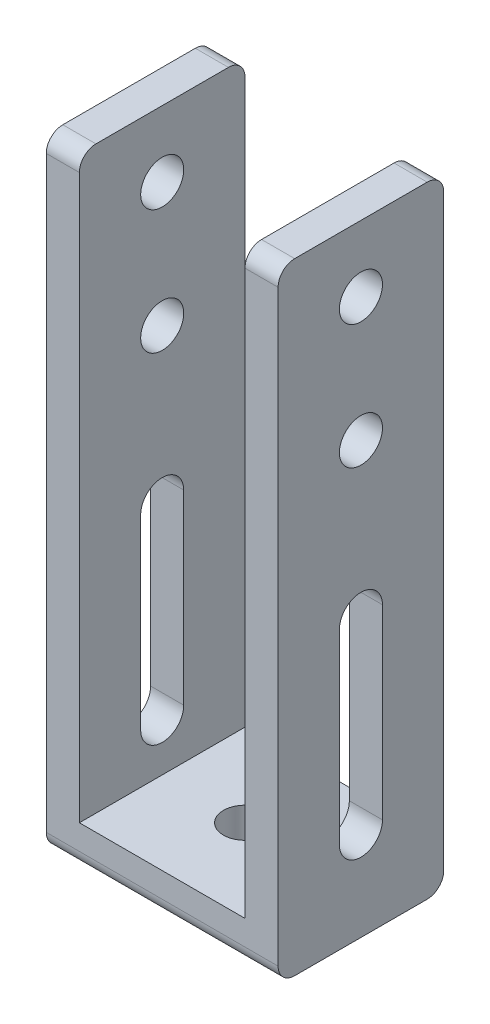
ISO-10303-21;
HEADER;
FILE_DESCRIPTION(('STEP AP214'),'2;1');
FILE_NAME('part.step','',(''),(''),'','','');
FILE_SCHEMA(('AUTOMOTIVE_DESIGN { 1 0 10303 214 1 1 1 1 }'));
ENDSEC;
DATA;
#1=APPLICATION_CONTEXT('core data for automotive mechanical design processes');
#2=APPLICATION_PROTOCOL_DEFINITION('international standard','automotive_design',2000,#1);
#3=PRODUCT_CONTEXT('',#1,'mechanical');
#4=PRODUCT('Part','Part','',(#3));
#5=PRODUCT_RELATED_PRODUCT_CATEGORY('part','',(#4));
#6=PRODUCT_DEFINITION_FORMATION('','',#4);
#7=PRODUCT_DEFINITION_CONTEXT('part definition',#1,'design');
#8=PRODUCT_DEFINITION('design','',#6,#7);
#9=PRODUCT_DEFINITION_SHAPE('','',#8);
#10=(LENGTH_UNIT() NAMED_UNIT(*) SI_UNIT(.MILLI.,.METRE.));
#11=(NAMED_UNIT(*) PLANE_ANGLE_UNIT() SI_UNIT($,.RADIAN.));
#12=(NAMED_UNIT(*) SI_UNIT($,.STERADIAN.) SOLID_ANGLE_UNIT());
#13=UNCERTAINTY_MEASURE_WITH_UNIT(LENGTH_MEASURE(1.E-05),#10,'distance_accuracy_value','');
#14=(GEOMETRIC_REPRESENTATION_CONTEXT(3) GLOBAL_UNCERTAINTY_ASSIGNED_CONTEXT((#13)) GLOBAL_UNIT_ASSIGNED_CONTEXT((#10,
#11,#12)) REPRESENTATION_CONTEXT('',''));
#15=CARTESIAN_POINT('',(0.,0.,0.));
#16=DIRECTION('',(0.,0.,1.));
#17=DIRECTION('',(1.,0.,0.));
#18=AXIS2_PLACEMENT_3D('',#15,#16,#17);
#19=CARTESIAN_POINT('',(0.,5.,0.));
#20=DIRECTION('',(0.,1.,0.));
#21=DIRECTION('',(0.,0.,1.));
#22=AXIS2_PLACEMENT_3D('',#19,#20,#21);
#23=PLANE('',#22);
#24=CARTESIAN_POINT('',(0.,5.,0.));
#25=DIRECTION('',(0.,-1.,0.));
#26=DIRECTION('',(0.,0.,-1.));
#27=AXIS2_PLACEMENT_3D('',#24,#25,#26);
#28=CIRCLE('',#27,2.6);
#29=CARTESIAN_POINT('',(0.,5.,-2.6));
#30=VERTEX_POINT('',#29);
#31=EDGE_CURVE('E285',#30,#30,#28,.T.);
#32=ORIENTED_EDGE('',*,*,#31,.T.);
#33=EDGE_LOOP('',(#32));
#34=FACE_BOUND('',#33,.T.);
#35=DIRECTION('',(1.,0.,0.));
#36=VECTOR('',#35,1.);
#37=CARTESIAN_POINT('',(-14.,5.,10.));
#38=LINE('',#37,#36);
#39=CARTESIAN_POINT('',(-10.,5.,10.));
#40=VERTEX_POINT('',#39);
#41=CARTESIAN_POINT('',(10.,5.,10.));
#42=VERTEX_POINT('',#41);
#43=EDGE_CURVE('E332',#40,#42,#38,.T.);
#44=ORIENTED_EDGE('',*,*,#43,.T.);
#45=DIRECTION('',(0.,0.,1.));
#46=VECTOR('',#45,1.);
#47=CARTESIAN_POINT('',(10.,5.,-10.));
#48=LINE('',#47,#46);
#49=CARTESIAN_POINT('',(10.,5.,-10.));
#50=VERTEX_POINT('',#49);
#51=EDGE_CURVE('E299',#50,#42,#48,.T.);
#52=ORIENTED_EDGE('',*,*,#51,.F.);
#53=DIRECTION('',(-1.,0.,0.));
#54=VECTOR('',#53,1.);
#55=CARTESIAN_POINT('',(-14.,5.,-10.));
#56=LINE('',#55,#54);
#57=CARTESIAN_POINT('',(-10.,5.,-10.));
#58=VERTEX_POINT('',#57);
#59=EDGE_CURVE('E328',#50,#58,#56,.T.);
#60=ORIENTED_EDGE('',*,*,#59,.T.);
#61=DIRECTION('',(0.,0.,-1.));
#62=VECTOR('',#61,1.);
#63=CARTESIAN_POINT('',(-10.,5.,-10.));
#64=LINE('',#63,#62);
#65=EDGE_CURVE('E303',#40,#58,#64,.T.);
#66=ORIENTED_EDGE('',*,*,#65,.F.);
#67=EDGE_LOOP('',(#44,#52,#60,#66));
#68=FACE_BOUND('',#67,.T.);
#69=ADVANCED_FACE('F43',(#34,#68),#23,.T.);
#70=CARTESIAN_POINT('',(14.,5.,-10.));
#71=DIRECTION('',(-1.,0.,0.));
#72=DIRECTION('',(0.,0.,1.));
#73=AXIS2_PLACEMENT_3D('',#70,#71,#72);
#74=PLANE('',#73);
#75=CARTESIAN_POINT('',(14.,67.,0.));
#76=DIRECTION('',(1.,0.,0.));
#77=DIRECTION('',(0.,0.,-1.));
#78=AXIS2_PLACEMENT_3D('',#75,#76,#77);
#79=CIRCLE('',#78,2.60000000000001);
#80=CARTESIAN_POINT('',(14.,67.,-2.60000000000001));
#81=VERTEX_POINT('',#80);
#82=EDGE_CURVE('E229',#81,#81,#79,.T.);
#83=ORIENTED_EDGE('',*,*,#82,.F.);
#84=EDGE_LOOP('',(#83));
#85=FACE_BOUND('',#84,.T.);
#86=CARTESIAN_POINT('',(14.,52.,0.));
#87=DIRECTION('',(1.,0.,0.));
#88=DIRECTION('',(0.,0.,-1.));
#89=AXIS2_PLACEMENT_3D('',#86,#87,#88);
#90=CIRCLE('',#89,2.6);
#91=CARTESIAN_POINT('',(14.,52.,-2.6));
#92=VERTEX_POINT('',#91);
#93=EDGE_CURVE('E224',#92,#92,#90,.T.);
#94=ORIENTED_EDGE('',*,*,#93,.F.);
#95=EDGE_LOOP('',(#94));
#96=FACE_BOUND('',#95,.T.);
#97=DIRECTION('',(0.,-1.,0.));
#98=VECTOR('',#97,1.);
#99=CARTESIAN_POINT('',(14.,33.5,2.6));
#100=LINE('',#99,#98);
#101=CARTESIAN_POINT('',(14.,33.5,2.6));
#102=VERTEX_POINT('',#101);
#103=CARTESIAN_POINT('',(14.,11.,2.6));
#104=VERTEX_POINT('',#103);
#105=EDGE_CURVE('E222',#102,#104,#100,.T.);
#106=ORIENTED_EDGE('',*,*,#105,.F.);
#107=CARTESIAN_POINT('',(14.,33.5,0.));
#108=DIRECTION('',(1.,0.,0.));
#109=DIRECTION('',(0.,0.,-1.));
#110=AXIS2_PLACEMENT_3D('',#107,#108,#109);
#111=CIRCLE('',#110,2.6);
#112=CARTESIAN_POINT('',(14.,33.5,-2.6));
#113=VERTEX_POINT('',#112);
#114=EDGE_CURVE('E197',#113,#102,#111,.T.);
#115=ORIENTED_EDGE('',*,*,#114,.F.);
#116=DIRECTION('',(0.,1.,0.));
#117=VECTOR('',#116,1.);
#118=CARTESIAN_POINT('',(14.,33.5,-2.6));
#119=LINE('',#118,#117);
#120=CARTESIAN_POINT('',(14.,11.,-2.6));
#121=VERTEX_POINT('',#120);
#122=EDGE_CURVE('E207',#121,#113,#119,.T.);
#123=ORIENTED_EDGE('',*,*,#122,.F.);
#124=CARTESIAN_POINT('',(14.,11.,0.));
#125=DIRECTION('',(1.,0.,0.));
#126=DIRECTION('',(0.,0.,-1.));
#127=AXIS2_PLACEMENT_3D('',#124,#125,#126);
#128=CIRCLE('',#127,2.6);
#129=EDGE_CURVE('E215',#104,#121,#128,.T.);
#130=ORIENTED_EDGE('',*,*,#129,.F.);
#131=EDGE_LOOP('',(#106,#115,#123,#130));
#132=FACE_BOUND('',#131,.T.);
#133=DIRECTION('',(0.,-1.,0.));
#134=VECTOR('',#133,1.);
#135=CARTESIAN_POINT('',(14.,5.,10.));
#136=LINE('',#135,#134);
#137=CARTESIAN_POINT('',(14.,73.,10.));
#138=VERTEX_POINT('',#137);
#139=CARTESIAN_POINT('',(14.,2.,10.));
#140=VERTEX_POINT('',#139);
#141=EDGE_CURVE('E337',#138,#140,#136,.T.);
#142=ORIENTED_EDGE('',*,*,#141,.T.);
#143=CARTESIAN_POINT('',(14.,2.,8.));
#144=DIRECTION('',(-1.,0.,0.));
#145=DIRECTION('',(0.,0.,1.));
#146=AXIS2_PLACEMENT_3D('',#143,#144,#145);
#147=CIRCLE('',#146,2.);
#148=CARTESIAN_POINT('',(14.,0.,8.));
#149=VERTEX_POINT('',#148);
#150=EDGE_CURVE('E397',#140,#149,#147,.F.);
#151=ORIENTED_EDGE('',*,*,#150,.T.);
#152=DIRECTION('',(0.,0.,-1.));
#153=VECTOR('',#152,1.);
#154=CARTESIAN_POINT('',(14.,0.,-10.));
#155=LINE('',#154,#153);
#156=CARTESIAN_POINT('',(14.,0.,-8.));
#157=VERTEX_POINT('',#156);
#158=EDGE_CURVE('E327',#149,#157,#155,.T.);
#159=ORIENTED_EDGE('',*,*,#158,.T.);
#160=CARTESIAN_POINT('',(14.,2.,-8.));
#161=DIRECTION('',(-1.,0.,0.));
#162=DIRECTION('',(0.,0.,1.));
#163=AXIS2_PLACEMENT_3D('',#160,#161,#162);
#164=CIRCLE('',#163,2.);
#165=CARTESIAN_POINT('',(14.,2.,-10.));
#166=VERTEX_POINT('',#165);
#167=EDGE_CURVE('E394',#157,#166,#164,.F.);
#168=ORIENTED_EDGE('',*,*,#167,.T.);
#169=DIRECTION('',(0.,-1.,0.));
#170=VECTOR('',#169,1.);
#171=CARTESIAN_POINT('',(14.,5.,-10.));
#172=LINE('',#171,#170);
#173=CARTESIAN_POINT('',(14.,73.,-10.));
#174=VERTEX_POINT('',#173);
#175=EDGE_CURVE('E355',#174,#166,#172,.T.);
#176=ORIENTED_EDGE('',*,*,#175,.F.);
#177=CARTESIAN_POINT('',(14.,73.,-8.));
#178=DIRECTION('',(-1.,0.,0.));
#179=DIRECTION('',(0.,0.,1.));
#180=AXIS2_PLACEMENT_3D('',#177,#178,#179);
#181=CIRCLE('',#180,2.);
#182=CARTESIAN_POINT('',(14.,75.,-8.));
#183=VERTEX_POINT('',#182);
#184=EDGE_CURVE('E391',#174,#183,#181,.F.);
#185=ORIENTED_EDGE('',*,*,#184,.T.);
#186=DIRECTION('',(0.,0.,-1.));
#187=VECTOR('',#186,1.);
#188=CARTESIAN_POINT('',(14.,75.,-10.));
#189=LINE('',#188,#187);
#190=CARTESIAN_POINT('',(14.,75.,8.));
#191=VERTEX_POINT('',#190);
#192=EDGE_CURVE('E304',#191,#183,#189,.T.);
#193=ORIENTED_EDGE('',*,*,#192,.F.);
#194=CARTESIAN_POINT('',(14.,73.,8.));
#195=DIRECTION('',(-1.,0.,0.));
#196=DIRECTION('',(0.,0.,1.));
#197=AXIS2_PLACEMENT_3D('',#194,#195,#196);
#198=CIRCLE('',#197,2.);
#199=EDGE_CURVE('E388',#191,#138,#198,.F.);
#200=ORIENTED_EDGE('',*,*,#199,.T.);
#201=EDGE_LOOP('',(#142,#151,#159,#168,#176,#185,#193,#200));
#202=FACE_BOUND('',#201,.T.);
#203=ADVANCED_FACE('F219',(#85,#96,#132,#202),#74,.F.);
#204=CARTESIAN_POINT('',(-14.,5.,-10.));
#205=DIRECTION('',(0.,0.,1.));
#206=DIRECTION('',(1.,0.,0.));
#207=AXIS2_PLACEMENT_3D('',#204,#205,#206);
#208=PLANE('',#207);
#209=ORIENTED_EDGE('',*,*,#175,.T.);
#210=DIRECTION('',(-1.,0.,0.));
#211=VECTOR('',#210,1.);
#212=CARTESIAN_POINT('',(-14.,2.,-10.));
#213=LINE('',#212,#211);
#214=CARTESIAN_POINT('',(-14.,2.,-10.));
#215=VERTEX_POINT('',#214);
#216=EDGE_CURVE('E424',#166,#215,#213,.T.);
#217=ORIENTED_EDGE('',*,*,#216,.T.);
#218=DIRECTION('',(0.,-1.,0.));
#219=VECTOR('',#218,1.);
#220=CARTESIAN_POINT('',(-14.,5.,-10.));
#221=LINE('',#220,#219);
#222=CARTESIAN_POINT('',(-14.,73.,-10.));
#223=VERTEX_POINT('',#222);
#224=EDGE_CURVE('E351',#223,#215,#221,.T.);
#225=ORIENTED_EDGE('',*,*,#224,.F.);
#226=DIRECTION('',(-1.,0.,0.));
#227=VECTOR('',#226,1.);
#228=CARTESIAN_POINT('',(-10.,73.,-10.));
#229=LINE('',#228,#227);
#230=CARTESIAN_POINT('',(-10.,73.,-10.));
#231=VERTEX_POINT('',#230);
#232=EDGE_CURVE('E418',#223,#231,#229,.F.);
#233=ORIENTED_EDGE('',*,*,#232,.T.);
#234=DIRECTION('',(0.,-1.,0.));
#235=VECTOR('',#234,1.);
#236=CARTESIAN_POINT('',(-10.,75.,-10.));
#237=LINE('',#236,#235);
#238=EDGE_CURVE('E318',#231,#58,#237,.T.);
#239=ORIENTED_EDGE('',*,*,#238,.T.);
#240=ORIENTED_EDGE('',*,*,#59,.F.);
#241=DIRECTION('',(0.,-1.,0.));
#242=VECTOR('',#241,1.);
#243=CARTESIAN_POINT('',(10.,75.,-10.));
#244=LINE('',#243,#242);
#245=CARTESIAN_POINT('',(10.,73.,-10.));
#246=VERTEX_POINT('',#245);
#247=EDGE_CURVE('E289',#246,#50,#244,.T.);
#248=ORIENTED_EDGE('',*,*,#247,.F.);
#249=DIRECTION('',(-1.,0.,0.));
#250=VECTOR('',#249,1.);
#251=CARTESIAN_POINT('',(-14.,73.,-10.));
#252=LINE('',#251,#250);
#253=EDGE_CURVE('E421',#246,#174,#252,.F.);
#254=ORIENTED_EDGE('',*,*,#253,.T.);
#255=EDGE_LOOP('',(#209,#217,#225,#233,#239,#240,#248,#254));
#256=FACE_BOUND('',#255,.T.);
#257=ADVANCED_FACE('F469',(#256),#208,.F.);
#258=CARTESIAN_POINT('',(-14.,5.,-10.));
#259=DIRECTION('',(1.,0.,0.));
#260=DIRECTION('',(0.,0.,-1.));
#261=AXIS2_PLACEMENT_3D('',#258,#259,#260);
#262=PLANE('',#261);
#263=CARTESIAN_POINT('',(-14.,67.,0.));
#264=DIRECTION('',(1.,0.,0.));
#265=DIRECTION('',(0.,0.,-1.));
#266=AXIS2_PLACEMENT_3D('',#263,#264,#265);
#267=CIRCLE('',#266,2.60000000000001);
#268=CARTESIAN_POINT('',(-14.,67.,-2.6));
#269=VERTEX_POINT('',#268);
#270=EDGE_CURVE('E280',#269,#269,#267,.T.);
#271=ORIENTED_EDGE('',*,*,#270,.T.);
#272=EDGE_LOOP('',(#271));
#273=FACE_BOUND('',#272,.T.);
#274=CARTESIAN_POINT('',(-14.,52.,0.));
#275=DIRECTION('',(1.,0.,0.));
#276=DIRECTION('',(0.,0.,-1.));
#277=AXIS2_PLACEMENT_3D('',#274,#275,#276);
#278=CIRCLE('',#277,2.6);
#279=CARTESIAN_POINT('',(-14.,52.,-2.6));
#280=VERTEX_POINT('',#279);
#281=EDGE_CURVE('E271',#280,#280,#278,.T.);
#282=ORIENTED_EDGE('',*,*,#281,.T.);
#283=EDGE_LOOP('',(#282));
#284=FACE_BOUND('',#283,.T.);
#285=DIRECTION('',(0.,1.,0.));
#286=VECTOR('',#285,1.);
#287=CARTESIAN_POINT('',(-14.,5.,-2.6));
#288=LINE('',#287,#286);
#289=CARTESIAN_POINT('',(-14.,11.,-2.6));
#290=VERTEX_POINT('',#289);
#291=CARTESIAN_POINT('',(-14.,33.5,-2.6));
#292=VERTEX_POINT('',#291);
#293=EDGE_CURVE('E254',#290,#292,#288,.T.);
#294=ORIENTED_EDGE('',*,*,#293,.T.);
#295=CARTESIAN_POINT('',(-14.,33.5,0.));
#296=DIRECTION('',(1.,0.,0.));
#297=DIRECTION('',(0.,0.,-1.));
#298=AXIS2_PLACEMENT_3D('',#295,#296,#297);
#299=CIRCLE('',#298,2.6);
#300=CARTESIAN_POINT('',(-14.,33.5,2.6));
#301=VERTEX_POINT('',#300);
#302=EDGE_CURVE('E262',#292,#301,#299,.T.);
#303=ORIENTED_EDGE('',*,*,#302,.T.);
#304=DIRECTION('',(0.,-1.,0.));
#305=VECTOR('',#304,1.);
#306=CARTESIAN_POINT('',(-14.,5.,2.6));
#307=LINE('',#306,#305);
#308=CARTESIAN_POINT('',(-14.,11.,2.6));
#309=VERTEX_POINT('',#308);
#310=EDGE_CURVE('E238',#301,#309,#307,.T.);
#311=ORIENTED_EDGE('',*,*,#310,.T.);
#312=CARTESIAN_POINT('',(-14.,11.,0.));
#313=DIRECTION('',(1.,0.,0.));
#314=DIRECTION('',(0.,0.,-1.));
#315=AXIS2_PLACEMENT_3D('',#312,#313,#314);
#316=CIRCLE('',#315,2.6);
#317=EDGE_CURVE('E246',#309,#290,#316,.T.);
#318=ORIENTED_EDGE('',*,*,#317,.T.);
#319=EDGE_LOOP('',(#294,#303,#311,#318));
#320=FACE_BOUND('',#319,.T.);
#321=DIRECTION('',(0.,0.,1.));
#322=VECTOR('',#321,1.);
#323=CARTESIAN_POINT('',(-14.,0.,-10.));
#324=LINE('',#323,#322);
#325=CARTESIAN_POINT('',(-14.,0.,-8.));
#326=VERTEX_POINT('',#325);
#327=CARTESIAN_POINT('',(-14.,0.,8.));
#328=VERTEX_POINT('',#327);
#329=EDGE_CURVE('E333',#326,#328,#324,.T.);
#330=ORIENTED_EDGE('',*,*,#329,.T.);
#331=CARTESIAN_POINT('',(-14.,2.,8.));
#332=DIRECTION('',(1.,0.,0.));
#333=DIRECTION('',(0.,0.,-1.));
#334=AXIS2_PLACEMENT_3D('',#331,#332,#333);
#335=CIRCLE('',#334,2.);
#336=CARTESIAN_POINT('',(-14.,2.,10.));
#337=VERTEX_POINT('',#336);
#338=EDGE_CURVE('E415',#328,#337,#335,.F.);
#339=ORIENTED_EDGE('',*,*,#338,.T.);
#340=DIRECTION('',(0.,-1.,0.));
#341=VECTOR('',#340,1.);
#342=CARTESIAN_POINT('',(-14.,5.,10.));
#343=LINE('',#342,#341);
#344=CARTESIAN_POINT('',(-14.,73.,10.));
#345=VERTEX_POINT('',#344);
#346=EDGE_CURVE('E347',#345,#337,#343,.T.);
#347=ORIENTED_EDGE('',*,*,#346,.F.);
#348=CARTESIAN_POINT('',(-14.,73.,8.));
#349=DIRECTION('',(1.,0.,0.));
#350=DIRECTION('',(0.,0.,-1.));
#351=AXIS2_PLACEMENT_3D('',#348,#349,#350);
#352=CIRCLE('',#351,2.);
#353=CARTESIAN_POINT('',(-14.,75.,8.));
#354=VERTEX_POINT('',#353);
#355=EDGE_CURVE('E406',#345,#354,#352,.F.);
#356=ORIENTED_EDGE('',*,*,#355,.T.);
#357=DIRECTION('',(0.,0.,1.));
#358=VECTOR('',#357,1.);
#359=CARTESIAN_POINT('',(-14.,75.,-10.));
#360=LINE('',#359,#358);
#361=CARTESIAN_POINT('',(-14.,75.,-8.));
#362=VERTEX_POINT('',#361);
#363=EDGE_CURVE('E311',#362,#354,#360,.T.);
#364=ORIENTED_EDGE('',*,*,#363,.F.);
#365=CARTESIAN_POINT('',(-14.,73.,-8.));
#366=DIRECTION('',(1.,0.,0.));
#367=DIRECTION('',(0.,0.,-1.));
#368=AXIS2_PLACEMENT_3D('',#365,#366,#367);
#369=CIRCLE('',#368,2.);
#370=EDGE_CURVE('E409',#362,#223,#369,.F.);
#371=ORIENTED_EDGE('',*,*,#370,.T.);
#372=ORIENTED_EDGE('',*,*,#224,.T.);
#373=CARTESIAN_POINT('',(-14.,2.,-8.));
#374=DIRECTION('',(1.,0.,0.));
#375=DIRECTION('',(0.,0.,-1.));
#376=AXIS2_PLACEMENT_3D('',#373,#374,#375);
#377=CIRCLE('',#376,2.);
#378=EDGE_CURVE('E412',#215,#326,#377,.F.);
#379=ORIENTED_EDGE('',*,*,#378,.T.);
#380=EDGE_LOOP('',(#330,#339,#347,#356,#364,#371,#372,#379));
#381=FACE_BOUND('',#380,.T.);
#382=ADVANCED_FACE('F460',(#273,#284,#320,#381),#262,.F.);
#383=CARTESIAN_POINT('',(-14.,5.,10.));
#384=DIRECTION('',(0.,0.,-1.));
#385=DIRECTION('',(-1.,0.,0.));
#386=AXIS2_PLACEMENT_3D('',#383,#384,#385);
#387=PLANE('',#386);
#388=ORIENTED_EDGE('',*,*,#346,.T.);
#389=DIRECTION('',(1.,0.,0.));
#390=VECTOR('',#389,1.);
#391=CARTESIAN_POINT('',(-14.,2.,10.));
#392=LINE('',#391,#390);
#393=EDGE_CURVE('E384',#337,#140,#392,.T.);
#394=ORIENTED_EDGE('',*,*,#393,.T.);
#395=ORIENTED_EDGE('',*,*,#141,.F.);
#396=DIRECTION('',(1.,0.,0.));
#397=VECTOR('',#396,1.);
#398=CARTESIAN_POINT('',(-14.,73.,10.));
#399=LINE('',#398,#397);
#400=CARTESIAN_POINT('',(10.,73.,10.));
#401=VERTEX_POINT('',#400);
#402=EDGE_CURVE('E372',#138,#401,#399,.F.);
#403=ORIENTED_EDGE('',*,*,#402,.T.);
#404=DIRECTION('',(0.,-1.,0.));
#405=VECTOR('',#404,1.);
#406=CARTESIAN_POINT('',(10.,75.,10.));
#407=LINE('',#406,#405);
#408=EDGE_CURVE('E295',#401,#42,#407,.T.);
#409=ORIENTED_EDGE('',*,*,#408,.T.);
#410=ORIENTED_EDGE('',*,*,#43,.F.);
#411=DIRECTION('',(0.,-1.,0.));
#412=VECTOR('',#411,1.);
#413=CARTESIAN_POINT('',(-10.,75.,10.));
#414=LINE('',#413,#412);
#415=CARTESIAN_POINT('',(-10.,73.,10.));
#416=VERTEX_POINT('',#415);
#417=EDGE_CURVE('E324',#416,#40,#414,.T.);
#418=ORIENTED_EDGE('',*,*,#417,.F.);
#419=DIRECTION('',(1.,0.,0.));
#420=VECTOR('',#419,1.);
#421=CARTESIAN_POINT('',(-14.,73.,10.));
#422=LINE('',#421,#420);
#423=EDGE_CURVE('E381',#416,#345,#422,.F.);
#424=ORIENTED_EDGE('',*,*,#423,.T.);
#425=EDGE_LOOP('',(#388,#394,#395,#403,#409,#410,#418,#424));
#426=FACE_BOUND('',#425,.T.);
#427=ADVANCED_FACE('F454',(#426),#387,.F.);
#428=CARTESIAN_POINT('',(0.,0.,0.));
#429=DIRECTION('',(0.,1.,0.));
#430=DIRECTION('',(0.,0.,1.));
#431=AXIS2_PLACEMENT_3D('',#428,#429,#430);
#432=PLANE('',#431);
#433=CARTESIAN_POINT('',(0.,0.,0.));
#434=DIRECTION('',(0.,-1.,0.));
#435=DIRECTION('',(0.,0.,-1.));
#436=AXIS2_PLACEMENT_3D('',#433,#434,#435);
#437=CIRCLE('',#436,2.6);
#438=CARTESIAN_POINT('',(0.,0.,-2.6));
#439=VERTEX_POINT('',#438);
#440=EDGE_CURVE('E284',#439,#439,#437,.T.);
#441=ORIENTED_EDGE('',*,*,#440,.F.);
#442=EDGE_LOOP('',(#441));
#443=FACE_BOUND('',#442,.T.);
#444=ORIENTED_EDGE('',*,*,#158,.F.);
#445=DIRECTION('',(1.,0.,0.));
#446=VECTOR('',#445,1.);
#447=CARTESIAN_POINT('',(0.,0.,8.));
#448=LINE('',#447,#446);
#449=EDGE_CURVE('E403',#149,#328,#448,.F.);
#450=ORIENTED_EDGE('',*,*,#449,.T.);
#451=ORIENTED_EDGE('',*,*,#329,.F.);
#452=DIRECTION('',(-1.,0.,0.));
#453=VECTOR('',#452,1.);
#454=CARTESIAN_POINT('',(0.,0.,-8.));
#455=LINE('',#454,#453);
#456=EDGE_CURVE('E400',#326,#157,#455,.F.);
#457=ORIENTED_EDGE('',*,*,#456,.T.);
#458=EDGE_LOOP('',(#444,#450,#451,#457));
#459=FACE_BOUND('',#458,.T.);
#460=ADVANCED_FACE('F480',(#443,#459),#432,.F.);
#461=CARTESIAN_POINT('',(-10.,75.,-10.));
#462=DIRECTION('',(-1.,0.,0.));
#463=DIRECTION('',(0.,0.,1.));
#464=AXIS2_PLACEMENT_3D('',#461,#462,#463);
#465=PLANE('',#464);
#466=CARTESIAN_POINT('',(-9.99999999999999,67.,0.));
#467=DIRECTION('',(-1.,0.,0.));
#468=DIRECTION('',(0.,0.,1.));
#469=AXIS2_PLACEMENT_3D('',#466,#467,#468);
#470=CIRCLE('',#469,2.60000000000001);
#471=CARTESIAN_POINT('',(-9.99999999999999,67.,2.60000000000001));
#472=VERTEX_POINT('',#471);
#473=EDGE_CURVE('E276',#472,#472,#470,.T.);
#474=ORIENTED_EDGE('',*,*,#473,.T.);
#475=EDGE_LOOP('',(#474));
#476=FACE_BOUND('',#475,.T.);
#477=CARTESIAN_POINT('',(-9.99999999999999,52.,0.));
#478=DIRECTION('',(-1.,0.,0.));
#479=DIRECTION('',(0.,0.,1.));
#480=AXIS2_PLACEMENT_3D('',#477,#478,#479);
#481=CIRCLE('',#480,2.6);
#482=CARTESIAN_POINT('',(-9.99999999999999,52.,2.6));
#483=VERTEX_POINT('',#482);
#484=EDGE_CURVE('E267',#483,#483,#481,.T.);
#485=ORIENTED_EDGE('',*,*,#484,.T.);
#486=EDGE_LOOP('',(#485));
#487=FACE_BOUND('',#486,.T.);
#488=DIRECTION('',(0.,1.,0.));
#489=VECTOR('',#488,1.);
#490=CARTESIAN_POINT('',(-10.,75.,2.6));
#491=LINE('',#490,#489);
#492=CARTESIAN_POINT('',(-9.99999999999999,11.,2.6));
#493=VERTEX_POINT('',#492);
#494=CARTESIAN_POINT('',(-10.,33.5,2.6));
#495=VERTEX_POINT('',#494);
#496=EDGE_CURVE('E234',#493,#495,#491,.T.);
#497=ORIENTED_EDGE('',*,*,#496,.T.);
#498=CARTESIAN_POINT('',(-9.99999999999999,33.5,0.));
#499=DIRECTION('',(-1.,0.,0.));
#500=DIRECTION('',(0.,0.,1.));
#501=AXIS2_PLACEMENT_3D('',#498,#499,#500);
#502=CIRCLE('',#501,2.6);
#503=CARTESIAN_POINT('',(-9.99999999999999,33.5,-2.6));
#504=VERTEX_POINT('',#503);
#505=EDGE_CURVE('E258',#495,#504,#502,.T.);
#506=ORIENTED_EDGE('',*,*,#505,.T.);
#507=DIRECTION('',(0.,-1.,0.));
#508=VECTOR('',#507,1.);
#509=CARTESIAN_POINT('',(-10.,75.,-2.6));
#510=LINE('',#509,#508);
#511=CARTESIAN_POINT('',(-9.99999999999999,11.,-2.6));
#512=VERTEX_POINT('',#511);
#513=EDGE_CURVE('E250',#504,#512,#510,.T.);
#514=ORIENTED_EDGE('',*,*,#513,.T.);
#515=CARTESIAN_POINT('',(-9.99999999999999,11.,0.));
#516=DIRECTION('',(-1.,0.,0.));
#517=DIRECTION('',(0.,0.,1.));
#518=AXIS2_PLACEMENT_3D('',#515,#516,#517);
#519=CIRCLE('',#518,2.6);
#520=EDGE_CURVE('E242',#512,#493,#519,.T.);
#521=ORIENTED_EDGE('',*,*,#520,.T.);
#522=EDGE_LOOP('',(#497,#506,#514,#521));
#523=FACE_BOUND('',#522,.T.);
#524=ORIENTED_EDGE('',*,*,#238,.F.);
#525=CARTESIAN_POINT('',(-10.,73.,-8.));
#526=DIRECTION('',(-1.,0.,0.));
#527=DIRECTION('',(0.,0.,1.));
#528=AXIS2_PLACEMENT_3D('',#525,#526,#527);
#529=CIRCLE('',#528,2.);
#530=CARTESIAN_POINT('',(-10.,75.,-8.));
#531=VERTEX_POINT('',#530);
#532=EDGE_CURVE('E11',#231,#531,#529,.F.);
#533=ORIENTED_EDGE('',*,*,#532,.T.);
#534=DIRECTION('',(0.,0.,-1.));
#535=VECTOR('',#534,1.);
#536=CARTESIAN_POINT('',(-10.,75.,-10.));
#537=LINE('',#536,#535);
#538=CARTESIAN_POINT('',(-10.,75.,8.));
#539=VERTEX_POINT('',#538);
#540=EDGE_CURVE('E315',#539,#531,#537,.T.);
#541=ORIENTED_EDGE('',*,*,#540,.F.);
#542=CARTESIAN_POINT('',(-10.,73.,8.));
#543=DIRECTION('',(-1.,0.,0.));
#544=DIRECTION('',(0.,0.,1.));
#545=AXIS2_PLACEMENT_3D('',#542,#543,#544);
#546=CIRCLE('',#545,2.);
#547=EDGE_CURVE('E52',#539,#416,#546,.F.);
#548=ORIENTED_EDGE('',*,*,#547,.T.);
#549=ORIENTED_EDGE('',*,*,#417,.T.);
#550=ORIENTED_EDGE('',*,*,#65,.T.);
#551=EDGE_LOOP('',(#524,#533,#541,#548,#549,#550));
#552=FACE_BOUND('',#551,.T.);
#553=ADVANCED_FACE('F450',(#476,#487,#523,#552),#465,.F.);
#554=CARTESIAN_POINT('',(0.,75.,0.));
#555=DIRECTION('',(0.,1.,0.));
#556=DIRECTION('',(0.,0.,1.));
#557=AXIS2_PLACEMENT_3D('',#554,#555,#556);
#558=PLANE('',#557);
#559=ORIENTED_EDGE('',*,*,#540,.T.);
#560=DIRECTION('',(-1.,0.,0.));
#561=VECTOR('',#560,1.);
#562=CARTESIAN_POINT('',(-14.,75.,-8.));
#563=LINE('',#562,#561);
#564=EDGE_CURVE('E445',#531,#362,#563,.T.);
#565=ORIENTED_EDGE('',*,*,#564,.T.);
#566=ORIENTED_EDGE('',*,*,#363,.T.);
#567=DIRECTION('',(1.,0.,0.));
#568=VECTOR('',#567,1.);
#569=CARTESIAN_POINT('',(-10.,75.,8.));
#570=LINE('',#569,#568);
#571=EDGE_CURVE('E442',#354,#539,#570,.T.);
#572=ORIENTED_EDGE('',*,*,#571,.T.);
#573=EDGE_LOOP('',(#559,#565,#566,#572));
#574=FACE_BOUND('',#573,.T.);
#575=ADVANCED_FACE('F462',(#574),#558,.T.);
#576=CARTESIAN_POINT('',(10.,75.,-10.));
#577=DIRECTION('',(1.,0.,0.));
#578=DIRECTION('',(0.,0.,-1.));
#579=AXIS2_PLACEMENT_3D('',#576,#577,#578);
#580=PLANE('',#579);
#581=CARTESIAN_POINT('',(10.,67.,0.));
#582=DIRECTION('',(1.,0.,0.));
#583=DIRECTION('',(0.,0.,-1.));
#584=AXIS2_PLACEMENT_3D('',#581,#582,#583);
#585=CIRCLE('',#584,2.60000000000001);
#586=CARTESIAN_POINT('',(10.,67.,-2.60000000000001));
#587=VERTEX_POINT('',#586);
#588=EDGE_CURVE('E275',#587,#587,#585,.T.);
#589=ORIENTED_EDGE('',*,*,#588,.T.);
#590=EDGE_LOOP('',(#589));
#591=FACE_BOUND('',#590,.T.);
#592=CARTESIAN_POINT('',(10.,52.,0.));
#593=DIRECTION('',(1.,0.,0.));
#594=DIRECTION('',(0.,0.,-1.));
#595=AXIS2_PLACEMENT_3D('',#592,#593,#594);
#596=CIRCLE('',#595,2.6);
#597=CARTESIAN_POINT('',(10.,52.,-2.6));
#598=VERTEX_POINT('',#597);
#599=EDGE_CURVE('E266',#598,#598,#596,.T.);
#600=ORIENTED_EDGE('',*,*,#599,.T.);
#601=EDGE_LOOP('',(#600));
#602=FACE_BOUND('',#601,.T.);
#603=DIRECTION('',(0.,1.,0.));
#604=VECTOR('',#603,1.);
#605=CARTESIAN_POINT('',(10.,75.,-2.6));
#606=LINE('',#605,#604);
#607=CARTESIAN_POINT('',(10.,11.,-2.6));
#608=VERTEX_POINT('',#607);
#609=CARTESIAN_POINT('',(10.,33.5,-2.6));
#610=VERTEX_POINT('',#609);
#611=EDGE_CURVE('E367',#608,#610,#606,.T.);
#612=ORIENTED_EDGE('',*,*,#611,.T.);
#613=CARTESIAN_POINT('',(10.,33.5,0.));
#614=DIRECTION('',(1.,0.,0.));
#615=DIRECTION('',(0.,0.,-1.));
#616=AXIS2_PLACEMENT_3D('',#613,#614,#615);
#617=CIRCLE('',#616,2.6);
#618=CARTESIAN_POINT('',(10.,33.5,2.6));
#619=VERTEX_POINT('',#618);
#620=EDGE_CURVE('E200',#610,#619,#617,.T.);
#621=ORIENTED_EDGE('',*,*,#620,.T.);
#622=DIRECTION('',(0.,-1.,0.));
#623=VECTOR('',#622,1.);
#624=CARTESIAN_POINT('',(10.,75.,2.6));
#625=LINE('',#624,#623);
#626=CARTESIAN_POINT('',(10.,11.,2.6));
#627=VERTEX_POINT('',#626);
#628=EDGE_CURVE('E359',#619,#627,#625,.T.);
#629=ORIENTED_EDGE('',*,*,#628,.T.);
#630=CARTESIAN_POINT('',(10.,11.,0.));
#631=DIRECTION('',(1.,0.,0.));
#632=DIRECTION('',(0.,0.,-1.));
#633=AXIS2_PLACEMENT_3D('',#630,#631,#632);
#634=CIRCLE('',#633,2.6);
#635=EDGE_CURVE('E363',#627,#608,#634,.T.);
#636=ORIENTED_EDGE('',*,*,#635,.T.);
#637=EDGE_LOOP('',(#612,#621,#629,#636));
#638=FACE_BOUND('',#637,.T.);
#639=DIRECTION('',(0.,0.,1.));
#640=VECTOR('',#639,1.);
#641=CARTESIAN_POINT('',(10.,75.,-10.));
#642=LINE('',#641,#640);
#643=CARTESIAN_POINT('',(10.,75.,-8.));
#644=VERTEX_POINT('',#643);
#645=CARTESIAN_POINT('',(10.,75.,8.));
#646=VERTEX_POINT('',#645);
#647=EDGE_CURVE('E298',#644,#646,#642,.T.);
#648=ORIENTED_EDGE('',*,*,#647,.F.);
#649=CARTESIAN_POINT('',(10.,73.,-8.));
#650=DIRECTION('',(1.,0.,0.));
#651=DIRECTION('',(0.,0.,-1.));
#652=AXIS2_PLACEMENT_3D('',#649,#650,#651);
#653=CIRCLE('',#652,2.);
#654=EDGE_CURVE('E439',#644,#246,#653,.F.);
#655=ORIENTED_EDGE('',*,*,#654,.T.);
#656=ORIENTED_EDGE('',*,*,#247,.T.);
#657=ORIENTED_EDGE('',*,*,#51,.T.);
#658=ORIENTED_EDGE('',*,*,#408,.F.);
#659=CARTESIAN_POINT('',(10.,73.,8.));
#660=DIRECTION('',(1.,0.,0.));
#661=DIRECTION('',(0.,0.,-1.));
#662=AXIS2_PLACEMENT_3D('',#659,#660,#661);
#663=CIRCLE('',#662,2.);
#664=EDGE_CURVE('E436',#401,#646,#663,.F.);
#665=ORIENTED_EDGE('',*,*,#664,.T.);
#666=EDGE_LOOP('',(#648,#655,#656,#657,#658,#665));
#667=FACE_BOUND('',#666,.T.);
#668=ADVANCED_FACE('F496',(#591,#602,#638,#667),#580,.F.);
#669=CARTESIAN_POINT('',(0.,75.,0.));
#670=DIRECTION('',(0.,-1.,0.));
#671=DIRECTION('',(0.,0.,-1.));
#672=AXIS2_PLACEMENT_3D('',#669,#670,#671);
#673=PLANE('',#672);
#674=ORIENTED_EDGE('',*,*,#192,.T.);
#675=DIRECTION('',(-1.,0.,0.));
#676=VECTOR('',#675,1.);
#677=CARTESIAN_POINT('',(0.,75.,-8.));
#678=LINE('',#677,#676);
#679=EDGE_CURVE('E432',#183,#644,#678,.T.);
#680=ORIENTED_EDGE('',*,*,#679,.T.);
#681=ORIENTED_EDGE('',*,*,#647,.T.);
#682=DIRECTION('',(1.,0.,0.));
#683=VECTOR('',#682,1.);
#684=CARTESIAN_POINT('',(0.,75.,8.));
#685=LINE('',#684,#683);
#686=EDGE_CURVE('E428',#646,#191,#685,.T.);
#687=ORIENTED_EDGE('',*,*,#686,.T.);
#688=EDGE_LOOP('',(#674,#680,#681,#687));
#689=FACE_BOUND('',#688,.T.);
#690=ADVANCED_FACE('F492',(#689),#673,.F.);
#691=CARTESIAN_POINT('',(0.,5.,0.));
#692=DIRECTION('',(0.,-1.,0.));
#693=DIRECTION('',(0.,0.,-1.));
#694=AXIS2_PLACEMENT_3D('',#691,#692,#693);
#695=CYLINDRICAL_SURFACE('',#694,2.6);
#696=ORIENTED_EDGE('',*,*,#31,.F.);
#697=EDGE_LOOP('',(#696));
#698=FACE_BOUND('',#697,.T.);
#699=ORIENTED_EDGE('',*,*,#440,.T.);
#700=EDGE_LOOP('',(#699));
#701=FACE_BOUND('',#700,.T.);
#702=ADVANCED_FACE('F598',(#698,#701),#695,.F.);
#703=CARTESIAN_POINT('',(-26.,33.5,2.6));
#704=DIRECTION('',(0.,0.,1.));
#705=DIRECTION('',(1.,0.,0.));
#706=AXIS2_PLACEMENT_3D('',#703,#704,#705);
#707=PLANE('',#706);
#708=DIRECTION('',(1.,0.,0.));
#709=VECTOR('',#708,1.);
#710=CARTESIAN_POINT('',(-26.,33.5,2.6));
#711=LINE('',#710,#709);
#712=EDGE_CURVE('E590',#619,#102,#711,.T.);
#713=ORIENTED_EDGE('',*,*,#712,.T.);
#714=ORIENTED_EDGE('',*,*,#105,.T.);
#715=DIRECTION('',(1.,0.,0.));
#716=VECTOR('',#715,1.);
#717=CARTESIAN_POINT('',(-26.,11.,2.6));
#718=LINE('',#717,#716);
#719=EDGE_CURVE('E583',#627,#104,#718,.T.);
#720=ORIENTED_EDGE('',*,*,#719,.F.);
#721=ORIENTED_EDGE('',*,*,#628,.F.);
#722=EDGE_LOOP('',(#713,#714,#720,#721));
#723=FACE_BOUND('',#722,.T.);
#724=ADVANCED_FACE('F596',(#723),#707,.F.);
#725=CARTESIAN_POINT('',(-26.,11.,0.));
#726=DIRECTION('',(1.,0.,0.));
#727=DIRECTION('',(0.,0.,-1.));
#728=AXIS2_PLACEMENT_3D('',#725,#726,#727);
#729=CYLINDRICAL_SURFACE('',#728,2.6);
#730=ORIENTED_EDGE('',*,*,#719,.T.);
#731=ORIENTED_EDGE('',*,*,#129,.T.);
#732=DIRECTION('',(1.,0.,0.));
#733=VECTOR('',#732,1.);
#734=CARTESIAN_POINT('',(-26.,11.,-2.6));
#735=LINE('',#734,#733);
#736=EDGE_CURVE('E210',#608,#121,#735,.T.);
#737=ORIENTED_EDGE('',*,*,#736,.F.);
#738=ORIENTED_EDGE('',*,*,#635,.F.);
#739=EDGE_LOOP('',(#730,#731,#737,#738));
#740=FACE_BOUND('',#739,.T.);
#741=ADVANCED_FACE('F576',(#740),#729,.F.);
#742=CARTESIAN_POINT('',(-26.,33.5,-2.6));
#743=DIRECTION('',(0.,0.,-1.));
#744=DIRECTION('',(-1.,0.,0.));
#745=AXIS2_PLACEMENT_3D('',#742,#743,#744);
#746=PLANE('',#745);
#747=ORIENTED_EDGE('',*,*,#736,.T.);
#748=ORIENTED_EDGE('',*,*,#122,.T.);
#749=DIRECTION('',(1.,0.,0.));
#750=VECTOR('',#749,1.);
#751=CARTESIAN_POINT('',(-26.,33.5,-2.6));
#752=LINE('',#751,#750);
#753=EDGE_CURVE('E192',#610,#113,#752,.T.);
#754=ORIENTED_EDGE('',*,*,#753,.F.);
#755=ORIENTED_EDGE('',*,*,#611,.F.);
#756=EDGE_LOOP('',(#747,#748,#754,#755));
#757=FACE_BOUND('',#756,.T.);
#758=ADVANCED_FACE('F208',(#757),#746,.F.);
#759=CARTESIAN_POINT('',(-26.,33.5,0.));
#760=DIRECTION('',(1.,0.,0.));
#761=DIRECTION('',(0.,0.,-1.));
#762=AXIS2_PLACEMENT_3D('',#759,#760,#761);
#763=CYLINDRICAL_SURFACE('',#762,2.6);
#764=ORIENTED_EDGE('',*,*,#753,.T.);
#765=ORIENTED_EDGE('',*,*,#114,.T.);
#766=ORIENTED_EDGE('',*,*,#712,.F.);
#767=ORIENTED_EDGE('',*,*,#620,.F.);
#768=EDGE_LOOP('',(#764,#765,#766,#767));
#769=FACE_BOUND('',#768,.T.);
#770=ADVANCED_FACE('F194',(#769),#763,.F.);
#771=CARTESIAN_POINT('',(-26.,52.,0.));
#772=DIRECTION('',(1.,0.,0.));
#773=DIRECTION('',(0.,0.,-1.));
#774=AXIS2_PLACEMENT_3D('',#771,#772,#773);
#775=CYLINDRICAL_SURFACE('',#774,2.6);
#776=ORIENTED_EDGE('',*,*,#93,.T.);
#777=EDGE_LOOP('',(#776));
#778=FACE_BOUND('',#777,.T.);
#779=ORIENTED_EDGE('',*,*,#599,.F.);
#780=EDGE_LOOP('',(#779));
#781=FACE_BOUND('',#780,.T.);
#782=ADVANCED_FACE('F550',(#778,#781),#775,.F.);
#783=CARTESIAN_POINT('',(-26.,67.,0.));
#784=DIRECTION('',(1.,0.,0.));
#785=DIRECTION('',(0.,0.,-1.));
#786=AXIS2_PLACEMENT_3D('',#783,#784,#785);
#787=CYLINDRICAL_SURFACE('',#786,2.60000000000001);
#788=ORIENTED_EDGE('',*,*,#82,.T.);
#789=EDGE_LOOP('',(#788));
#790=FACE_BOUND('',#789,.T.);
#791=ORIENTED_EDGE('',*,*,#588,.F.);
#792=EDGE_LOOP('',(#791));
#793=FACE_BOUND('',#792,.T.);
#794=ADVANCED_FACE('F543',(#790,#793),#787,.F.);
#795=EDGE_CURVE('E204',#292,#504,#752,.T.);
#796=ORIENTED_EDGE('',*,*,#795,.T.);
#797=ORIENTED_EDGE('',*,*,#505,.F.);
#798=EDGE_CURVE('E216',#301,#495,#711,.T.);
#799=ORIENTED_EDGE('',*,*,#798,.F.);
#800=ORIENTED_EDGE('',*,*,#302,.F.);
#801=EDGE_LOOP('',(#796,#797,#799,#800));
#802=FACE_BOUND('',#801,.T.);
#803=ADVANCED_FACE('F554',(#802),#763,.F.);
#804=EDGE_CURVE('E578',#290,#512,#735,.T.);
#805=ORIENTED_EDGE('',*,*,#804,.T.);
#806=ORIENTED_EDGE('',*,*,#513,.F.);
#807=ORIENTED_EDGE('',*,*,#795,.F.);
#808=ORIENTED_EDGE('',*,*,#293,.F.);
#809=EDGE_LOOP('',(#805,#806,#807,#808));
#810=FACE_BOUND('',#809,.T.);
#811=ADVANCED_FACE('F560',(#810),#746,.F.);
#812=EDGE_CURVE('E592',#309,#493,#718,.T.);
#813=ORIENTED_EDGE('',*,*,#812,.T.);
#814=ORIENTED_EDGE('',*,*,#520,.F.);
#815=ORIENTED_EDGE('',*,*,#804,.F.);
#816=ORIENTED_EDGE('',*,*,#317,.F.);
#817=EDGE_LOOP('',(#813,#814,#815,#816));
#818=FACE_BOUND('',#817,.T.);
#819=ADVANCED_FACE('F605',(#818),#729,.F.);
#820=ORIENTED_EDGE('',*,*,#798,.T.);
#821=ORIENTED_EDGE('',*,*,#496,.F.);
#822=ORIENTED_EDGE('',*,*,#812,.F.);
#823=ORIENTED_EDGE('',*,*,#310,.F.);
#824=EDGE_LOOP('',(#820,#821,#822,#823));
#825=FACE_BOUND('',#824,.T.);
#826=ADVANCED_FACE('F547',(#825),#707,.F.);
#827=ORIENTED_EDGE('',*,*,#484,.F.);
#828=EDGE_LOOP('',(#827));
#829=FACE_BOUND('',#828,.T.);
#830=ORIENTED_EDGE('',*,*,#281,.F.);
#831=EDGE_LOOP('',(#830));
#832=FACE_BOUND('',#831,.T.);
#833=ADVANCED_FACE('F540',(#829,#832),#775,.F.);
#834=ORIENTED_EDGE('',*,*,#473,.F.);
#835=EDGE_LOOP('',(#834));
#836=FACE_BOUND('',#835,.T.);
#837=ORIENTED_EDGE('',*,*,#270,.F.);
#838=EDGE_LOOP('',(#837));
#839=FACE_BOUND('',#838,.T.);
#840=ADVANCED_FACE('F536',(#836,#839),#787,.F.);
#841=CARTESIAN_POINT('',(-14.,2.,8.));
#842=DIRECTION('',(1.,0.,0.));
#843=DIRECTION('',(0.,0.,-1.));
#844=AXIS2_PLACEMENT_3D('',#841,#842,#843);
#845=CYLINDRICAL_SURFACE('',#844,2.);
#846=ORIENTED_EDGE('',*,*,#338,.F.);
#847=ORIENTED_EDGE('',*,*,#449,.F.);
#848=ORIENTED_EDGE('',*,*,#150,.F.);
#849=ORIENTED_EDGE('',*,*,#393,.F.);
#850=EDGE_LOOP('',(#846,#847,#848,#849));
#851=FACE_BOUND('',#850,.T.);
#852=ADVANCED_FACE('F483',(#851),#845,.T.);
#853=CARTESIAN_POINT('',(-14.,2.,-8.));
#854=DIRECTION('',(-1.,0.,0.));
#855=DIRECTION('',(0.,0.,1.));
#856=AXIS2_PLACEMENT_3D('',#853,#854,#855);
#857=CYLINDRICAL_SURFACE('',#856,2.);
#858=ORIENTED_EDGE('',*,*,#167,.F.);
#859=ORIENTED_EDGE('',*,*,#456,.F.);
#860=ORIENTED_EDGE('',*,*,#378,.F.);
#861=ORIENTED_EDGE('',*,*,#216,.F.);
#862=EDGE_LOOP('',(#858,#859,#860,#861));
#863=FACE_BOUND('',#862,.T.);
#864=ADVANCED_FACE('F474',(#863),#857,.T.);
#865=CARTESIAN_POINT('',(0.,73.,-8.));
#866=DIRECTION('',(-1.,0.,0.));
#867=DIRECTION('',(0.,0.,1.));
#868=AXIS2_PLACEMENT_3D('',#865,#866,#867);
#869=CYLINDRICAL_SURFACE('',#868,2.);
#870=ORIENTED_EDGE('',*,*,#184,.F.);
#871=ORIENTED_EDGE('',*,*,#253,.F.);
#872=ORIENTED_EDGE('',*,*,#654,.F.);
#873=ORIENTED_EDGE('',*,*,#679,.F.);
#874=EDGE_LOOP('',(#870,#871,#872,#873));
#875=FACE_BOUND('',#874,.T.);
#876=ADVANCED_FACE('F505',(#875),#869,.T.);
#877=CARTESIAN_POINT('',(0.,73.,-8.));
#878=DIRECTION('',(1.,0.,0.));
#879=DIRECTION('',(0.,0.,-1.));
#880=AXIS2_PLACEMENT_3D('',#877,#878,#879);
#881=CYLINDRICAL_SURFACE('',#880,2.);
#882=ORIENTED_EDGE('',*,*,#532,.F.);
#883=ORIENTED_EDGE('',*,*,#232,.F.);
#884=ORIENTED_EDGE('',*,*,#370,.F.);
#885=ORIENTED_EDGE('',*,*,#564,.F.);
#886=EDGE_LOOP('',(#882,#883,#884,#885));
#887=FACE_BOUND('',#886,.T.);
#888=ADVANCED_FACE('F465',(#887),#881,.T.);
#889=CARTESIAN_POINT('',(0.,73.,8.));
#890=DIRECTION('',(-1.,0.,0.));
#891=DIRECTION('',(0.,0.,1.));
#892=AXIS2_PLACEMENT_3D('',#889,#890,#891);
#893=CYLINDRICAL_SURFACE('',#892,2.);
#894=ORIENTED_EDGE('',*,*,#355,.F.);
#895=ORIENTED_EDGE('',*,*,#423,.F.);
#896=ORIENTED_EDGE('',*,*,#547,.F.);
#897=ORIENTED_EDGE('',*,*,#571,.F.);
#898=EDGE_LOOP('',(#894,#895,#896,#897));
#899=FACE_BOUND('',#898,.T.);
#900=ADVANCED_FACE('F457',(#899),#893,.T.);
#901=CARTESIAN_POINT('',(0.,73.,8.));
#902=DIRECTION('',(1.,0.,0.));
#903=DIRECTION('',(0.,0.,-1.));
#904=AXIS2_PLACEMENT_3D('',#901,#902,#903);
#905=CYLINDRICAL_SURFACE('',#904,2.);
#906=ORIENTED_EDGE('',*,*,#664,.F.);
#907=ORIENTED_EDGE('',*,*,#402,.F.);
#908=ORIENTED_EDGE('',*,*,#199,.F.);
#909=ORIENTED_EDGE('',*,*,#686,.F.);
#910=EDGE_LOOP('',(#906,#907,#908,#909));
#911=FACE_BOUND('',#910,.T.);
#912=ADVANCED_FACE('F45',(#911),#905,.T.);
#913=CLOSED_SHELL('',(#69,#203,#257,#382,#427,#460,#553,#575,#668,#690,#702,#724,#741,#758,#770,
#782,#794,#803,#811,#819,#826,#833,#840,#852,#864,#876,#888,#900,#912));
#914=MANIFOLD_SOLID_BREP('B2',#913);
#915=ADVANCED_BREP_SHAPE_REPRESENTATION('',(#18,#914),#14);
#916=SHAPE_DEFINITION_REPRESENTATION(#9,#915);
ENDSEC;
END-ISO-10303-21;
